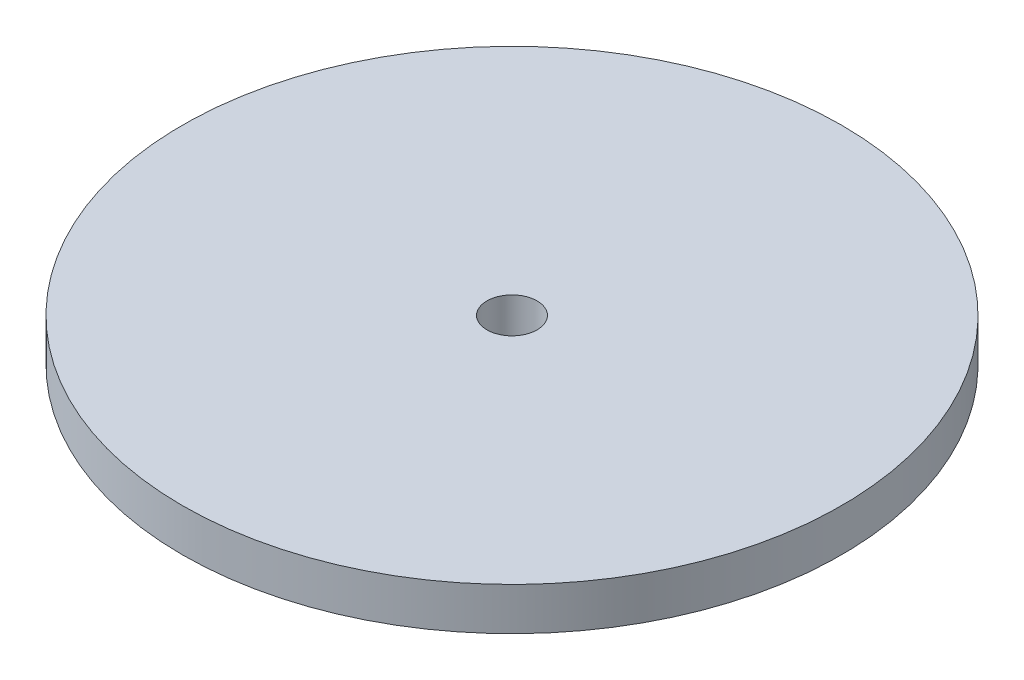
ISO-10303-21;
HEADER;
FILE_DESCRIPTION(('STEP AP214'),'2;1');
FILE_NAME('part.step','',(''),(''),'','','');
FILE_SCHEMA(('AUTOMOTIVE_DESIGN { 1 0 10303 214 1 1 1 1 }'));
ENDSEC;
DATA;
#1=APPLICATION_CONTEXT('core data for automotive mechanical design processes');
#2=APPLICATION_PROTOCOL_DEFINITION('international standard','automotive_design',2000,#1);
#3=PRODUCT_CONTEXT('',#1,'mechanical');
#4=PRODUCT('Part','Part','',(#3));
#5=PRODUCT_RELATED_PRODUCT_CATEGORY('part','',(#4));
#6=PRODUCT_DEFINITION_FORMATION('','',#4);
#7=PRODUCT_DEFINITION_CONTEXT('part definition',#1,'design');
#8=PRODUCT_DEFINITION('design','',#6,#7);
#9=PRODUCT_DEFINITION_SHAPE('','',#8);
#10=(LENGTH_UNIT() NAMED_UNIT(*) SI_UNIT(.MILLI.,.METRE.));
#11=(NAMED_UNIT(*) PLANE_ANGLE_UNIT() SI_UNIT($,.RADIAN.));
#12=(NAMED_UNIT(*) SI_UNIT($,.STERADIAN.) SOLID_ANGLE_UNIT());
#13=UNCERTAINTY_MEASURE_WITH_UNIT(LENGTH_MEASURE(1.E-05),#10,'distance_accuracy_value','');
#14=(GEOMETRIC_REPRESENTATION_CONTEXT(3) GLOBAL_UNCERTAINTY_ASSIGNED_CONTEXT((#13)) GLOBAL_UNIT_ASSIGNED_CONTEXT((#10,
#11,#12)) REPRESENTATION_CONTEXT('',''));
#15=CARTESIAN_POINT('',(0.,0.,0.));
#16=DIRECTION('',(0.,0.,1.));
#17=DIRECTION('',(1.,0.,0.));
#18=AXIS2_PLACEMENT_3D('',#15,#16,#17);
#19=CARTESIAN_POINT('',(4.3815,0.,0.));
#20=DIRECTION('',(0.,-1.,0.));
#21=DIRECTION('',(0.,0.,-1.));
#22=AXIS2_PLACEMENT_3D('',#19,#20,#21);
#23=PLANE('',#22);
#24=CARTESIAN_POINT('',(0.,0.,0.));
#25=DIRECTION('',(0.,-1.,0.));
#26=DIRECTION('',(0.,0.,-1.));
#27=AXIS2_PLACEMENT_3D('',#24,#25,#26);
#28=CIRCLE('',#27,4.3815);
#29=CARTESIAN_POINT('',(0.,0.,-4.3815));
#30=VERTEX_POINT('',#29);
#31=EDGE_CURVE('E59',#30,#30,#28,.T.);
#32=ORIENTED_EDGE('',*,*,#31,.T.);
#33=EDGE_LOOP('',(#32));
#34=FACE_BOUND('',#33,.T.);
#35=CARTESIAN_POINT('',(0.,0.,0.));
#36=DIRECTION('',(0.,-1.,0.));
#37=DIRECTION('',(0.,0.,-1.));
#38=AXIS2_PLACEMENT_3D('',#35,#36,#37);
#39=CIRCLE('',#38,2.794);
#40=CARTESIAN_POINT('',(0.,0.,-2.794));
#41=VERTEX_POINT('',#40);
#42=EDGE_CURVE('E10',#41,#41,#39,.T.);
#43=ORIENTED_EDGE('',*,*,#42,.F.);
#44=EDGE_LOOP('',(#43));
#45=FACE_BOUND('',#44,.T.);
#46=ADVANCED_FACE('F31',(#34,#45),#23,.T.);
#47=CARTESIAN_POINT('',(0.,0.,0.));
#48=DIRECTION('',(0.,-1.,0.));
#49=DIRECTION('',(0.,0.,-1.));
#50=AXIS2_PLACEMENT_3D('',#47,#48,#49);
#51=CYLINDRICAL_SURFACE('',#50,2.794);
#52=ORIENTED_EDGE('',*,*,#42,.T.);
#53=EDGE_LOOP('',(#52));
#54=FACE_BOUND('',#53,.T.);
#55=CARTESIAN_POINT('',(0.,3.3782,0.));
#56=DIRECTION('',(0.,-1.,0.));
#57=DIRECTION('',(0.,0.,-1.));
#58=AXIS2_PLACEMENT_3D('',#55,#56,#57);
#59=CIRCLE('',#58,2.794);
#60=CARTESIAN_POINT('',(0.,3.3782,-2.794));
#61=VERTEX_POINT('',#60);
#62=EDGE_CURVE('E37',#61,#61,#59,.T.);
#63=ORIENTED_EDGE('',*,*,#62,.F.);
#64=EDGE_LOOP('',(#63));
#65=FACE_BOUND('',#64,.T.);
#66=ADVANCED_FACE('F77',(#54,#65),#51,.F.);
#67=CARTESIAN_POINT('',(2.794,3.3782,0.));
#68=DIRECTION('',(0.,-1.,0.));
#69=DIRECTION('',(0.,0.,-1.));
#70=AXIS2_PLACEMENT_3D('',#67,#68,#69);
#71=PLANE('',#70);
#72=ORIENTED_EDGE('',*,*,#62,.T.);
#73=EDGE_LOOP('',(#72));
#74=FACE_BOUND('',#73,.T.);
#75=CARTESIAN_POINT('',(0.,3.3782,0.));
#76=DIRECTION('',(0.,-1.,0.));
#77=DIRECTION('',(0.,0.,-1.));
#78=AXIS2_PLACEMENT_3D('',#75,#76,#77);
#79=CIRCLE('',#78,1.3462);
#80=CARTESIAN_POINT('',(0.,3.3782,-1.3462));
#81=VERTEX_POINT('',#80);
#82=EDGE_CURVE('E41',#81,#81,#79,.T.);
#83=ORIENTED_EDGE('',*,*,#82,.F.);
#84=EDGE_LOOP('',(#83));
#85=FACE_BOUND('',#84,.T.);
#86=ADVANCED_FACE('F81',(#74,#85),#71,.T.);
#87=CARTESIAN_POINT('',(0.,0.,0.));
#88=DIRECTION('',(0.,-1.,0.));
#89=DIRECTION('',(0.,0.,-1.));
#90=AXIS2_PLACEMENT_3D('',#87,#88,#89);
#91=CYLINDRICAL_SURFACE('',#90,1.3462);
#92=ORIENTED_EDGE('',*,*,#82,.T.);
#93=EDGE_LOOP('',(#92));
#94=FACE_BOUND('',#93,.T.);
#95=CARTESIAN_POINT('',(0.,5.6642,0.));
#96=DIRECTION('',(0.,-1.,0.));
#97=DIRECTION('',(0.,0.,-1.));
#98=AXIS2_PLACEMENT_3D('',#95,#96,#97);
#99=CIRCLE('',#98,1.3462);
#100=CARTESIAN_POINT('',(0.,5.6642,-1.3462));
#101=VERTEX_POINT('',#100);
#102=EDGE_CURVE('E45',#101,#101,#99,.T.);
#103=ORIENTED_EDGE('',*,*,#102,.F.);
#104=EDGE_LOOP('',(#103));
#105=FACE_BOUND('',#104,.T.);
#106=ADVANCED_FACE('F85',(#94,#105),#91,.F.);
#107=CARTESIAN_POINT('',(1.3462,5.6642,0.));
#108=DIRECTION('',(0.,1.,0.));
#109=DIRECTION('',(0.,0.,1.));
#110=AXIS2_PLACEMENT_3D('',#107,#108,#109);
#111=PLANE('',#110);
#112=ORIENTED_EDGE('',*,*,#102,.T.);
#113=EDGE_LOOP('',(#112));
#114=FACE_BOUND('',#113,.T.);
#115=CARTESIAN_POINT('',(0.,5.6642,0.));
#116=DIRECTION('',(0.,-1.,0.));
#117=DIRECTION('',(0.,0.,-1.));
#118=AXIS2_PLACEMENT_3D('',#115,#116,#117);
#119=CIRCLE('',#118,17.6657);
#120=CARTESIAN_POINT('',(0.,5.6642,-17.6657));
#121=VERTEX_POINT('',#120);
#122=EDGE_CURVE('E50',#121,#121,#119,.T.);
#123=ORIENTED_EDGE('',*,*,#122,.F.);
#124=EDGE_LOOP('',(#123));
#125=FACE_BOUND('',#124,.T.);
#126=ADVANCED_FACE('F91',(#114,#125),#111,.T.);
#127=CARTESIAN_POINT('',(0.,0.,0.));
#128=DIRECTION('',(0.,-1.,0.));
#129=DIRECTION('',(0.,0.,-1.));
#130=AXIS2_PLACEMENT_3D('',#127,#128,#129);
#131=CYLINDRICAL_SURFACE('',#130,17.6657);
#132=ORIENTED_EDGE('',*,*,#122,.T.);
#133=EDGE_LOOP('',(#132));
#134=FACE_BOUND('',#133,.T.);
#135=CARTESIAN_POINT('',(0.,3.3782,0.));
#136=DIRECTION('',(0.,-1.,0.));
#137=DIRECTION('',(0.,0.,-1.));
#138=AXIS2_PLACEMENT_3D('',#135,#136,#137);
#139=CIRCLE('',#138,17.6657);
#140=CARTESIAN_POINT('',(0.,3.3782,-17.6657));
#141=VERTEX_POINT('',#140);
#142=EDGE_CURVE('E53',#141,#141,#139,.T.);
#143=ORIENTED_EDGE('',*,*,#142,.F.);
#144=EDGE_LOOP('',(#143));
#145=FACE_BOUND('',#144,.T.);
#146=ADVANCED_FACE('F73',(#134,#145),#131,.T.);
#147=CARTESIAN_POINT('',(17.6657,3.3782,0.));
#148=DIRECTION('',(0.,-1.,0.));
#149=DIRECTION('',(0.,0.,-1.));
#150=AXIS2_PLACEMENT_3D('',#147,#148,#149);
#151=PLANE('',#150);
#152=ORIENTED_EDGE('',*,*,#142,.T.);
#153=EDGE_LOOP('',(#152));
#154=FACE_BOUND('',#153,.T.);
#155=CARTESIAN_POINT('',(0.,3.3782,0.));
#156=DIRECTION('',(0.,-1.,0.));
#157=DIRECTION('',(0.,0.,-1.));
#158=AXIS2_PLACEMENT_3D('',#155,#156,#157);
#159=CIRCLE('',#158,4.3815);
#160=CARTESIAN_POINT('',(0.,3.3782,-4.3815));
#161=VERTEX_POINT('',#160);
#162=EDGE_CURVE('E56',#161,#161,#159,.T.);
#163=ORIENTED_EDGE('',*,*,#162,.F.);
#164=EDGE_LOOP('',(#163));
#165=FACE_BOUND('',#164,.T.);
#166=ADVANCED_FACE('F67',(#154,#165),#151,.T.);
#167=CARTESIAN_POINT('',(0.,0.,0.));
#168=DIRECTION('',(0.,-1.,0.));
#169=DIRECTION('',(0.,0.,-1.));
#170=AXIS2_PLACEMENT_3D('',#167,#168,#169);
#171=CYLINDRICAL_SURFACE('',#170,4.3815);
#172=ORIENTED_EDGE('',*,*,#162,.T.);
#173=EDGE_LOOP('',(#172));
#174=FACE_BOUND('',#173,.T.);
#175=ORIENTED_EDGE('',*,*,#31,.F.);
#176=EDGE_LOOP('',(#175));
#177=FACE_BOUND('',#176,.T.);
#178=ADVANCED_FACE('F65',(#174,#177),#171,.T.);
#179=CLOSED_SHELL('',(#46,#66,#86,#106,#126,#146,#166,#178));
#180=MANIFOLD_SOLID_BREP('B2',#179);
#181=ADVANCED_BREP_SHAPE_REPRESENTATION('',(#18,#180),#14);
#182=SHAPE_DEFINITION_REPRESENTATION(#9,#181);
ENDSEC;
END-ISO-10303-21;
